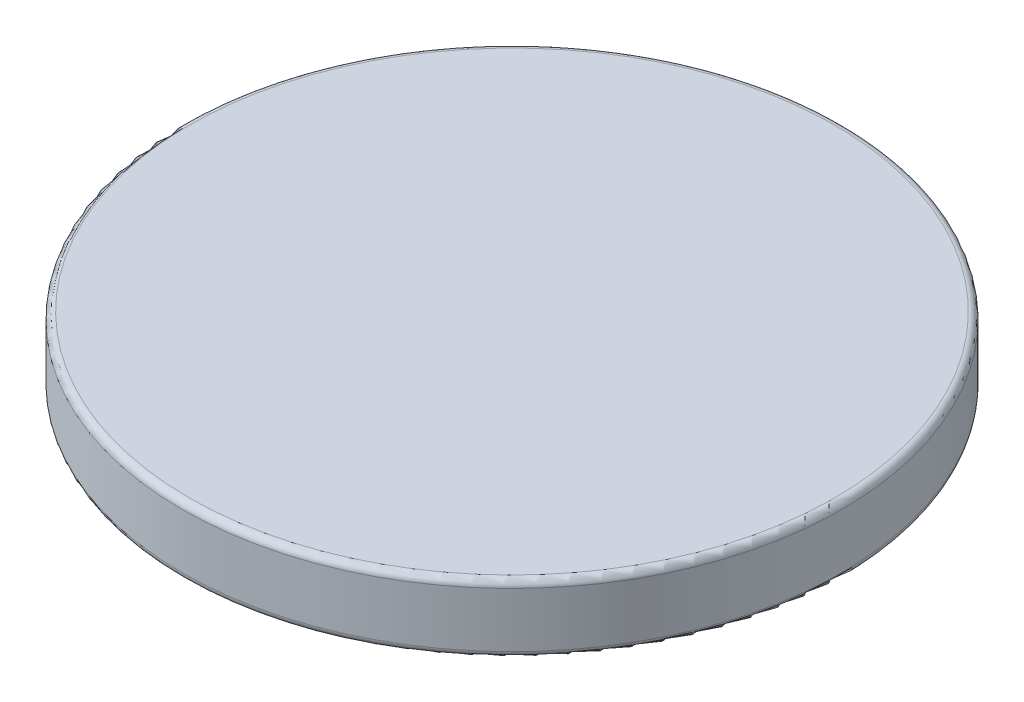
ISO-10303-21;
HEADER;
FILE_DESCRIPTION(('STEP AP214'),'2;1');
FILE_NAME('part.step','',(''),(''),'','','');
FILE_SCHEMA(('AUTOMOTIVE_DESIGN { 1 0 10303 214 1 1 1 1 }'));
ENDSEC;
DATA;
#1=APPLICATION_CONTEXT('core data for automotive mechanical design processes');
#2=APPLICATION_PROTOCOL_DEFINITION('international standard','automotive_design',2000,#1);
#3=PRODUCT_CONTEXT('',#1,'mechanical');
#4=PRODUCT('Part','Part','',(#3));
#5=PRODUCT_RELATED_PRODUCT_CATEGORY('part','',(#4));
#6=PRODUCT_DEFINITION_FORMATION('','',#4);
#7=PRODUCT_DEFINITION_CONTEXT('part definition',#1,'design');
#8=PRODUCT_DEFINITION('design','',#6,#7);
#9=PRODUCT_DEFINITION_SHAPE('','',#8);
#10=(LENGTH_UNIT() NAMED_UNIT(*) SI_UNIT(.MILLI.,.METRE.));
#11=(NAMED_UNIT(*) PLANE_ANGLE_UNIT() SI_UNIT($,.RADIAN.));
#12=(NAMED_UNIT(*) SI_UNIT($,.STERADIAN.) SOLID_ANGLE_UNIT());
#13=UNCERTAINTY_MEASURE_WITH_UNIT(LENGTH_MEASURE(1.E-05),#10,'distance_accuracy_value','');
#14=(GEOMETRIC_REPRESENTATION_CONTEXT(3) GLOBAL_UNCERTAINTY_ASSIGNED_CONTEXT((#13)) GLOBAL_UNIT_ASSIGNED_CONTEXT((#10,
#11,#12)) REPRESENTATION_CONTEXT('',''));
#15=CARTESIAN_POINT('',(0.,0.,0.));
#16=DIRECTION('',(0.,0.,1.));
#17=DIRECTION('',(1.,0.,0.));
#18=AXIS2_PLACEMENT_3D('',#15,#16,#17);
#19=CARTESIAN_POINT('',(0.,-12.7,0.));
#20=DIRECTION('',(0.,1.,0.));
#21=DIRECTION('',(0.,0.,1.));
#22=AXIS2_PLACEMENT_3D('',#19,#20,#21);
#23=CYLINDRICAL_SURFACE('',#22,61.214);
#24=CARTESIAN_POINT('',(0.,-11.43,0.));
#25=DIRECTION('',(0.,1.,0.));
#26=DIRECTION('',(0.,0.,1.));
#27=AXIS2_PLACEMENT_3D('',#24,#25,#26);
#28=CIRCLE('',#27,61.214);
#29=CARTESIAN_POINT('',(0.,-11.43,61.214));
#30=VERTEX_POINT('',#29);
#31=EDGE_CURVE('E42',#30,#30,#28,.T.);
#32=ORIENTED_EDGE('',*,*,#31,.T.);
#33=EDGE_LOOP('',(#32));
#34=FACE_BOUND('',#33,.T.);
#35=CARTESIAN_POINT('',(0.,-1.27,0.));
#36=DIRECTION('',(0.,1.,0.));
#37=DIRECTION('',(0.,0.,1.));
#38=AXIS2_PLACEMENT_3D('',#35,#36,#37);
#39=CIRCLE('',#38,61.214);
#40=CARTESIAN_POINT('',(0.,-1.27,61.214));
#41=VERTEX_POINT('',#40);
#42=EDGE_CURVE('E46',#41,#41,#39,.F.);
#43=ORIENTED_EDGE('',*,*,#42,.T.);
#44=EDGE_LOOP('',(#43));
#45=FACE_BOUND('',#44,.T.);
#46=ADVANCED_FACE('F31',(#34,#45),#23,.T.);
#47=CARTESIAN_POINT('',(0.,-12.7,0.));
#48=DIRECTION('',(0.,1.,0.));
#49=DIRECTION('',(0.,0.,1.));
#50=AXIS2_PLACEMENT_3D('',#47,#48,#49);
#51=PLANE('',#50);
#52=CARTESIAN_POINT('',(0.,-12.7,0.));
#53=DIRECTION('',(0.,1.,0.));
#54=DIRECTION('',(0.,0.,1.));
#55=AXIS2_PLACEMENT_3D('',#52,#53,#54);
#56=CIRCLE('',#55,59.944);
#57=CARTESIAN_POINT('',(0.,-12.7,59.944));
#58=VERTEX_POINT('',#57);
#59=EDGE_CURVE('E38',#58,#58,#56,.F.);
#60=ORIENTED_EDGE('',*,*,#59,.T.);
#61=EDGE_LOOP('',(#60));
#62=FACE_BOUND('',#61,.T.);
#63=ADVANCED_FACE('F62',(#62),#51,.F.);
#64=CARTESIAN_POINT('',(0.,0.,0.));
#65=DIRECTION('',(0.,1.,0.));
#66=DIRECTION('',(0.,0.,1.));
#67=AXIS2_PLACEMENT_3D('',#64,#65,#66);
#68=PLANE('',#67);
#69=CARTESIAN_POINT('',(0.,0.,0.));
#70=DIRECTION('',(0.,1.,0.));
#71=DIRECTION('',(0.,0.,1.));
#72=AXIS2_PLACEMENT_3D('',#69,#70,#71);
#73=CIRCLE('',#72,59.944);
#74=CARTESIAN_POINT('',(0.,0.,59.944));
#75=VERTEX_POINT('',#74);
#76=EDGE_CURVE('E10',#75,#75,#73,.T.);
#77=ORIENTED_EDGE('',*,*,#76,.T.);
#78=EDGE_LOOP('',(#77));
#79=FACE_BOUND('',#78,.T.);
#80=ADVANCED_FACE('F59',(#79),#68,.T.);
#81=CARTESIAN_POINT('',(0.,-11.43,0.));
#82=DIRECTION('',(0.,1.,0.));
#83=DIRECTION('',(0.,0.,1.));
#84=AXIS2_PLACEMENT_3D('',#81,#82,#83);
#85=TOROIDAL_SURFACE('',#84,59.944,1.27);
#86=ORIENTED_EDGE('',*,*,#59,.F.);
#87=EDGE_LOOP('',(#86));
#88=FACE_BOUND('',#87,.T.);
#89=ORIENTED_EDGE('',*,*,#31,.F.);
#90=EDGE_LOOP('',(#89));
#91=FACE_BOUND('',#90,.T.);
#92=ADVANCED_FACE('F55',(#88,#91),#85,.T.);
#93=CARTESIAN_POINT('',(0.,-1.27,0.));
#94=DIRECTION('',(0.,1.,0.));
#95=DIRECTION('',(0.,0.,1.));
#96=AXIS2_PLACEMENT_3D('',#93,#94,#95);
#97=TOROIDAL_SURFACE('',#96,59.944,1.27);
#98=ORIENTED_EDGE('',*,*,#42,.F.);
#99=EDGE_LOOP('',(#98));
#100=FACE_BOUND('',#99,.T.);
#101=ORIENTED_EDGE('',*,*,#76,.F.);
#102=EDGE_LOOP('',(#101));
#103=FACE_BOUND('',#102,.T.);
#104=ADVANCED_FACE('F33',(#100,#103),#97,.T.);
#105=CLOSED_SHELL('',(#46,#63,#80,#92,#104));
#106=MANIFOLD_SOLID_BREP('B2',#105);
#107=ADVANCED_BREP_SHAPE_REPRESENTATION('',(#18,#106),#14);
#108=SHAPE_DEFINITION_REPRESENTATION(#9,#107);
ENDSEC;
END-ISO-10303-21;
